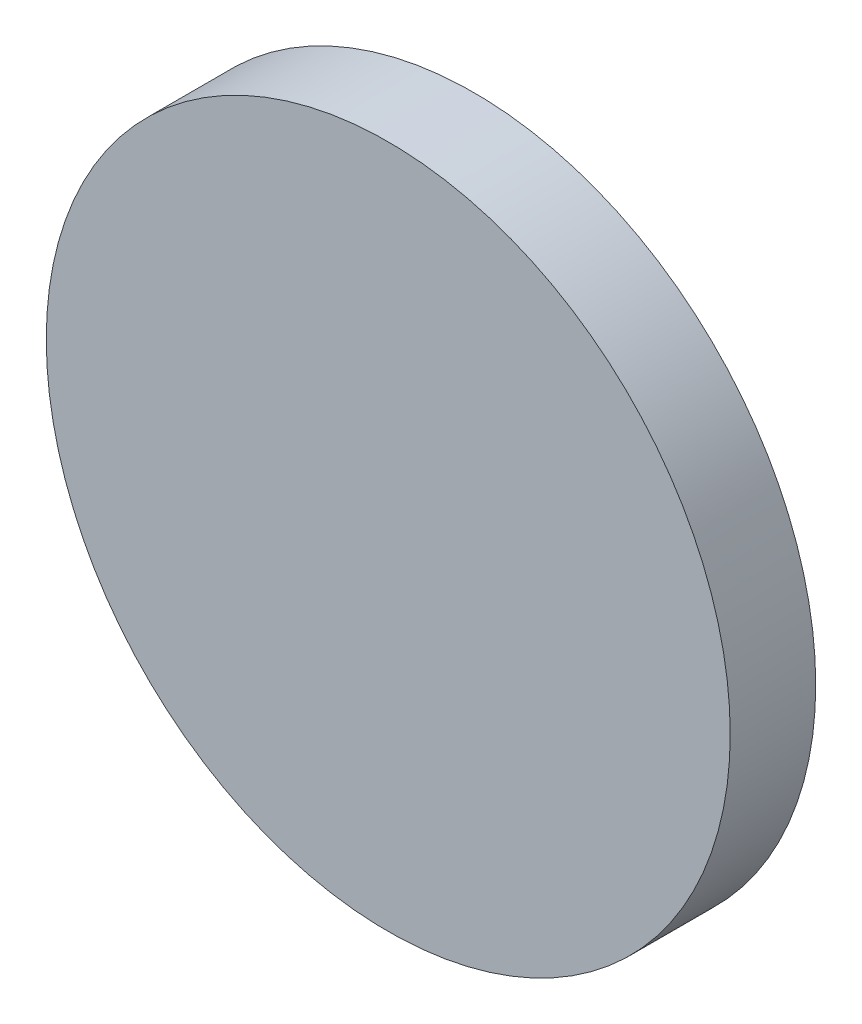
ISO-10303-21;
HEADER;
FILE_DESCRIPTION(('STEP AP214'),'2;1');
FILE_NAME('part.step','',(''),(''),'','','');
FILE_SCHEMA(('AUTOMOTIVE_DESIGN { 1 0 10303 214 1 1 1 1 }'));
ENDSEC;
DATA;
#1=APPLICATION_CONTEXT('core data for automotive mechanical design processes');
#2=APPLICATION_PROTOCOL_DEFINITION('international standard','automotive_design',2000,#1);
#3=PRODUCT_CONTEXT('',#1,'mechanical');
#4=PRODUCT('Part','Part','',(#3));
#5=PRODUCT_RELATED_PRODUCT_CATEGORY('part','',(#4));
#6=PRODUCT_DEFINITION_FORMATION('','',#4);
#7=PRODUCT_DEFINITION_CONTEXT('part definition',#1,'design');
#8=PRODUCT_DEFINITION('design','',#6,#7);
#9=PRODUCT_DEFINITION_SHAPE('','',#8);
#10=(LENGTH_UNIT() NAMED_UNIT(*) SI_UNIT(.MILLI.,.METRE.));
#11=(NAMED_UNIT(*) PLANE_ANGLE_UNIT() SI_UNIT($,.RADIAN.));
#12=(NAMED_UNIT(*) SI_UNIT($,.STERADIAN.) SOLID_ANGLE_UNIT());
#13=UNCERTAINTY_MEASURE_WITH_UNIT(LENGTH_MEASURE(1.E-05),#10,'distance_accuracy_value','');
#14=(GEOMETRIC_REPRESENTATION_CONTEXT(3) GLOBAL_UNCERTAINTY_ASSIGNED_CONTEXT((#13)) GLOBAL_UNIT_ASSIGNED_CONTEXT((#10,
#11,#12)) REPRESENTATION_CONTEXT('',''));
#15=CARTESIAN_POINT('',(0.,0.,0.));
#16=DIRECTION('',(0.,0.,1.));
#17=DIRECTION('',(1.,0.,0.));
#18=AXIS2_PLACEMENT_3D('',#15,#16,#17);
#19=CARTESIAN_POINT('',(0.,0.,10.));
#20=DIRECTION('',(0.,0.,-1.));
#21=DIRECTION('',(-1.,0.,0.));
#22=AXIS2_PLACEMENT_3D('',#19,#20,#21);
#23=CYLINDRICAL_SURFACE('',#22,40.);
#24=CARTESIAN_POINT('',(0.,0.,10.));
#25=DIRECTION('',(0.,0.,1.));
#26=DIRECTION('',(1.,0.,0.));
#27=AXIS2_PLACEMENT_3D('',#24,#25,#26);
#28=CIRCLE('',#27,40.);
#29=CARTESIAN_POINT('',(40.,0.,10.));
#30=VERTEX_POINT('',#29);
#31=EDGE_CURVE('E10',#30,#30,#28,.T.);
#32=ORIENTED_EDGE('',*,*,#31,.F.);
#33=EDGE_LOOP('',(#32));
#34=FACE_BOUND('',#33,.T.);
#35=CARTESIAN_POINT('',(0.,0.,0.));
#36=DIRECTION('',(0.,0.,1.));
#37=DIRECTION('',(1.,0.,0.));
#38=AXIS2_PLACEMENT_3D('',#35,#36,#37);
#39=CIRCLE('',#38,40.);
#40=CARTESIAN_POINT('',(40.,0.,0.));
#41=VERTEX_POINT('',#40);
#42=EDGE_CURVE('E39',#41,#41,#39,.T.);
#43=ORIENTED_EDGE('',*,*,#42,.T.);
#44=EDGE_LOOP('',(#43));
#45=FACE_BOUND('',#44,.T.);
#46=ADVANCED_FACE('F36',(#34,#45),#23,.T.);
#47=CARTESIAN_POINT('',(0.,0.,10.));
#48=DIRECTION('',(0.,0.,1.));
#49=DIRECTION('',(1.,0.,0.));
#50=AXIS2_PLACEMENT_3D('',#47,#48,#49);
#51=PLANE('',#50);
#52=ORIENTED_EDGE('',*,*,#31,.T.);
#53=EDGE_LOOP('',(#52));
#54=FACE_BOUND('',#53,.T.);
#55=ADVANCED_FACE('F51',(#54),#51,.T.);
#56=CARTESIAN_POINT('',(0.,0.,0.));
#57=DIRECTION('',(0.,0.,1.));
#58=DIRECTION('',(1.,0.,0.));
#59=AXIS2_PLACEMENT_3D('',#56,#57,#58);
#60=PLANE('',#59);
#61=ORIENTED_EDGE('',*,*,#42,.F.);
#62=EDGE_LOOP('',(#61));
#63=FACE_BOUND('',#62,.T.);
#64=ADVANCED_FACE('F49',(#63),#60,.F.);
#65=CLOSED_SHELL('',(#46,#55,#64));
#66=MANIFOLD_SOLID_BREP('B2',#65);
#67=ADVANCED_BREP_SHAPE_REPRESENTATION('',(#18,#66),#14);
#68=SHAPE_DEFINITION_REPRESENTATION(#9,#67);
ENDSEC;
END-ISO-10303-21;
